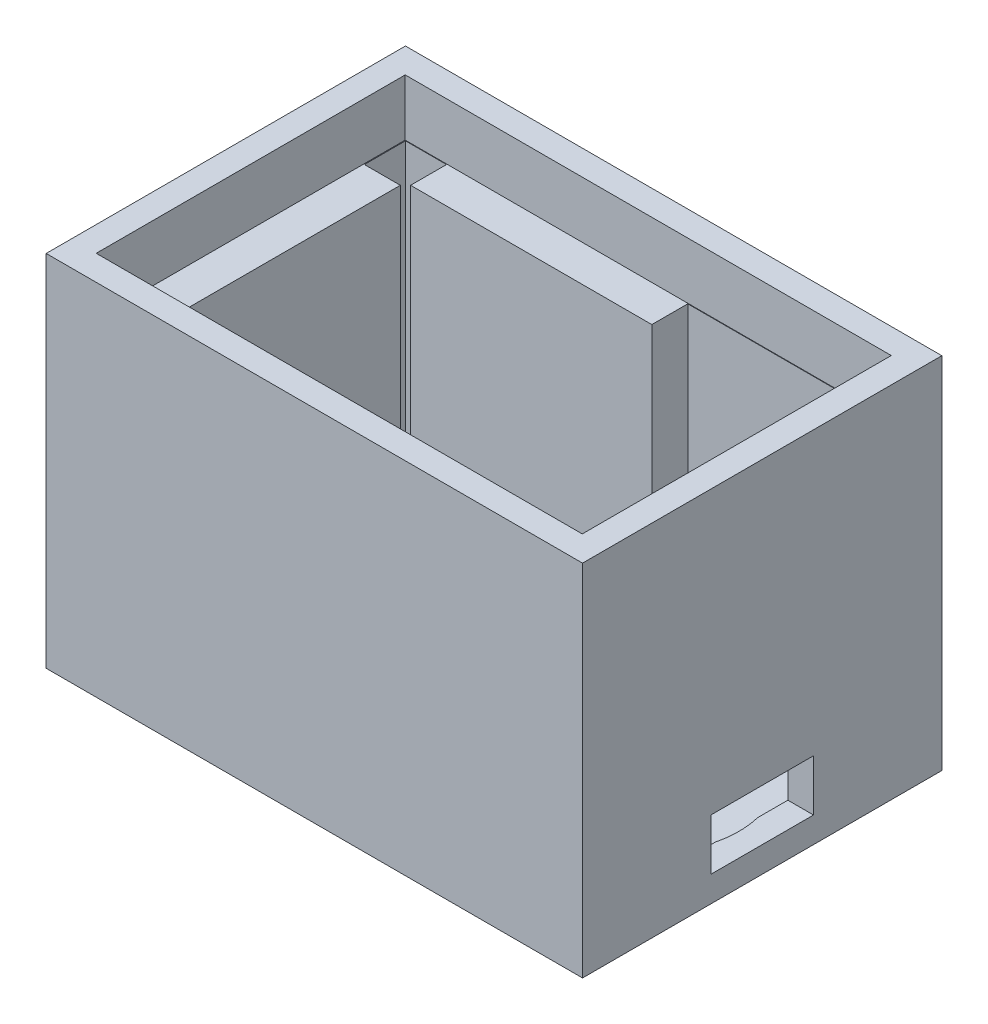
ISO-10303-21;
HEADER;
FILE_DESCRIPTION(('STEP AP214'),'2;1');
FILE_NAME('part.step','',(''),(''),'','','');
FILE_SCHEMA(('AUTOMOTIVE_DESIGN { 1 0 10303 214 1 1 1 1 }'));
ENDSEC;
DATA;
#1=APPLICATION_CONTEXT('core data for automotive mechanical design processes');
#2=APPLICATION_PROTOCOL_DEFINITION('international standard','automotive_design',2000,#1);
#3=PRODUCT_CONTEXT('',#1,'mechanical');
#4=PRODUCT('Part','Part','',(#3));
#5=PRODUCT_RELATED_PRODUCT_CATEGORY('part','',(#4));
#6=PRODUCT_DEFINITION_FORMATION('','',#4);
#7=PRODUCT_DEFINITION_CONTEXT('part definition',#1,'design');
#8=PRODUCT_DEFINITION('design','',#6,#7);
#9=PRODUCT_DEFINITION_SHAPE('','',#8);
#10=(LENGTH_UNIT() NAMED_UNIT(*) SI_UNIT(.MILLI.,.METRE.));
#11=(NAMED_UNIT(*) PLANE_ANGLE_UNIT() SI_UNIT($,.RADIAN.));
#12=(NAMED_UNIT(*) SI_UNIT($,.STERADIAN.) SOLID_ANGLE_UNIT());
#13=UNCERTAINTY_MEASURE_WITH_UNIT(LENGTH_MEASURE(1.E-05),#10,'distance_accuracy_value','');
#14=(GEOMETRIC_REPRESENTATION_CONTEXT(3) GLOBAL_UNCERTAINTY_ASSIGNED_CONTEXT((#13)) GLOBAL_UNIT_ASSIGNED_CONTEXT((#10,
#11,#12)) REPRESENTATION_CONTEXT('',''));
#15=CARTESIAN_POINT('',(0.,0.,0.));
#16=DIRECTION('',(0.,0.,1.));
#17=DIRECTION('',(1.,0.,0.));
#18=AXIS2_PLACEMENT_3D('',#15,#16,#17);
#19=CARTESIAN_POINT('',(82.5,4.00000000000001,-35.));
#20=DIRECTION('',(0.,1.,0.));
#21=DIRECTION('',(0.,0.,1.));
#22=AXIS2_PLACEMENT_3D('',#19,#20,#21);
#23=CYLINDRICAL_SURFACE('',#22,17.5);
#24=DIRECTION('',(0.,1.,0.));
#25=VECTOR('',#24,1.);
#26=CARTESIAN_POINT('',(99.5,4.00000000000001,-39.153311931459));
#27=LINE('',#26,#25);
#28=CARTESIAN_POINT('',(99.5,15.,-39.153311931459));
#29=VERTEX_POINT('',#28);
#30=CARTESIAN_POINT('',(99.5,59.,-39.153311931459));
#31=VERTEX_POINT('',#30);
#32=EDGE_CURVE('E364',#29,#31,#27,.T.);
#33=ORIENTED_EDGE('',*,*,#32,.F.);
#34=CARTESIAN_POINT('',(82.5,15.,-35.));
#35=DIRECTION('',(0.,1.,0.));
#36=DIRECTION('',(0.,0.,1.));
#37=AXIS2_PLACEMENT_3D('',#34,#35,#36);
#38=CIRCLE('',#37,17.5);
#39=CARTESIAN_POINT('',(99.5,15.,-30.846688068541));
#40=VERTEX_POINT('',#39);
#41=EDGE_CURVE('E296',#29,#40,#38,.F.);
#42=ORIENTED_EDGE('',*,*,#41,.T.);
#43=DIRECTION('',(0.,1.,0.));
#44=VECTOR('',#43,1.);
#45=CARTESIAN_POINT('',(99.5,4.00000000000001,-30.846688068541));
#46=LINE('',#45,#44);
#47=CARTESIAN_POINT('',(99.5,59.,-30.846688068541));
#48=VERTEX_POINT('',#47);
#49=EDGE_CURVE('E428',#40,#48,#46,.T.);
#50=ORIENTED_EDGE('',*,*,#49,.T.);
#51=CARTESIAN_POINT('',(82.5,59.,-35.));
#52=DIRECTION('',(0.,1.,0.));
#53=DIRECTION('',(0.,0.,1.));
#54=AXIS2_PLACEMENT_3D('',#51,#52,#53);
#55=CIRCLE('',#54,17.5);
#56=CARTESIAN_POINT('',(99.55,59.,-31.0569681715714));
#57=VERTEX_POINT('',#56);
#58=EDGE_CURVE('E365',#48,#57,#55,.T.);
#59=ORIENTED_EDGE('',*,*,#58,.T.);
#60=CARTESIAN_POINT('',(99.55,59.,-38.9430318284286));
#61=VERTEX_POINT('',#60);
#62=EDGE_CURVE('E302',#57,#61,#55,.T.);
#63=ORIENTED_EDGE('',*,*,#62,.T.);
#64=EDGE_CURVE('E369',#61,#31,#55,.T.);
#65=ORIENTED_EDGE('',*,*,#64,.T.);
#66=EDGE_LOOP('',(#33,#42,#50,#59,#63,#65));
#67=FACE_BOUND('',#66,.T.);
#68=ADVANCED_FACE('F35',(#67),#23,.F.);
#69=CARTESIAN_POINT('',(0.,70.,0.));
#70=DIRECTION('',(1.,0.,0.));
#71=DIRECTION('',(0.,0.,-1.));
#72=AXIS2_PLACEMENT_3D('',#69,#70,#71);
#73=PLANE('',#72);
#74=DIRECTION('',(0.,0.,1.));
#75=VECTOR('',#74,1.);
#76=CARTESIAN_POINT('',(0.,0.,0.));
#77=LINE('',#76,#75);
#78=CARTESIAN_POINT('',(0.,0.,-70.));
#79=VERTEX_POINT('',#78);
#80=CARTESIAN_POINT('',(0.,0.,0.));
#81=VERTEX_POINT('',#80);
#82=EDGE_CURVE('E496',#79,#81,#77,.T.);
#83=ORIENTED_EDGE('',*,*,#82,.T.);
#84=DIRECTION('',(0.,-1.,0.));
#85=VECTOR('',#84,1.);
#86=CARTESIAN_POINT('',(0.,70.,0.));
#87=LINE('',#86,#85);
#88=CARTESIAN_POINT('',(0.,70.,0.));
#89=VERTEX_POINT('',#88);
#90=EDGE_CURVE('E529',#89,#81,#87,.T.);
#91=ORIENTED_EDGE('',*,*,#90,.F.);
#92=DIRECTION('',(0.,0.,1.));
#93=VECTOR('',#92,1.);
#94=CARTESIAN_POINT('',(0.,70.,0.));
#95=LINE('',#94,#93);
#96=CARTESIAN_POINT('',(0.,70.,-70.));
#97=VERTEX_POINT('',#96);
#98=EDGE_CURVE('E503',#97,#89,#95,.T.);
#99=ORIENTED_EDGE('',*,*,#98,.F.);
#100=DIRECTION('',(0.,-1.,0.));
#101=VECTOR('',#100,1.);
#102=CARTESIAN_POINT('',(0.,70.,-70.));
#103=LINE('',#102,#101);
#104=EDGE_CURVE('E513',#97,#79,#103,.T.);
#105=ORIENTED_EDGE('',*,*,#104,.T.);
#106=EDGE_LOOP('',(#83,#91,#99,#105));
#107=FACE_BOUND('',#106,.T.);
#108=ADVANCED_FACE('F37',(#107),#73,.F.);
#109=CARTESIAN_POINT('',(0.,70.,0.));
#110=DIRECTION('',(0.,0.,-1.));
#111=DIRECTION('',(-1.,0.,0.));
#112=AXIS2_PLACEMENT_3D('',#109,#110,#111);
#113=PLANE('',#112);
#114=DIRECTION('',(1.,0.,0.));
#115=VECTOR('',#114,1.);
#116=CARTESIAN_POINT('',(0.,0.,0.));
#117=LINE('',#116,#115);
#118=CARTESIAN_POINT('',(104.5,0.,0.));
#119=VERTEX_POINT('',#118);
#120=EDGE_CURVE('E516',#81,#119,#117,.T.);
#121=ORIENTED_EDGE('',*,*,#120,.T.);
#122=DIRECTION('',(0.,-1.,0.));
#123=VECTOR('',#122,1.);
#124=CARTESIAN_POINT('',(104.5,70.,0.));
#125=LINE('',#124,#123);
#126=CARTESIAN_POINT('',(104.5,70.,0.));
#127=VERTEX_POINT('',#126);
#128=EDGE_CURVE('E526',#127,#119,#125,.T.);
#129=ORIENTED_EDGE('',*,*,#128,.F.);
#130=DIRECTION('',(1.,0.,0.));
#131=VECTOR('',#130,1.);
#132=CARTESIAN_POINT('',(0.,70.,0.));
#133=LINE('',#132,#131);
#134=EDGE_CURVE('E506',#89,#127,#133,.T.);
#135=ORIENTED_EDGE('',*,*,#134,.F.);
#136=ORIENTED_EDGE('',*,*,#90,.T.);
#137=EDGE_LOOP('',(#121,#129,#135,#136));
#138=FACE_BOUND('',#137,.T.);
#139=ADVANCED_FACE('F581',(#138),#113,.F.);
#140=CARTESIAN_POINT('',(104.5,70.,0.));
#141=DIRECTION('',(-1.,0.,0.));
#142=DIRECTION('',(0.,0.,1.));
#143=AXIS2_PLACEMENT_3D('',#140,#141,#142);
#144=PLANE('',#143);
#145=DIRECTION('',(0.,0.,-1.));
#146=VECTOR('',#145,1.);
#147=CARTESIAN_POINT('',(104.5,5.,-25.));
#148=LINE('',#147,#146);
#149=CARTESIAN_POINT('',(104.5,5.,-25.));
#150=VERTEX_POINT('',#149);
#151=CARTESIAN_POINT('',(104.5,5.,-45.));
#152=VERTEX_POINT('',#151);
#153=EDGE_CURVE('E274',#150,#152,#148,.T.);
#154=ORIENTED_EDGE('',*,*,#153,.F.);
#155=DIRECTION('',(0.,-1.,0.));
#156=VECTOR('',#155,1.);
#157=CARTESIAN_POINT('',(104.5,15.,-25.));
#158=LINE('',#157,#156);
#159=CARTESIAN_POINT('',(104.5,15.,-25.));
#160=VERTEX_POINT('',#159);
#161=EDGE_CURVE('E50',#160,#150,#158,.T.);
#162=ORIENTED_EDGE('',*,*,#161,.F.);
#163=DIRECTION('',(0.,0.,1.));
#164=VECTOR('',#163,1.);
#165=CARTESIAN_POINT('',(104.5,15.,-25.));
#166=LINE('',#165,#164);
#167=CARTESIAN_POINT('',(104.5,15.,-45.));
#168=VERTEX_POINT('',#167);
#169=EDGE_CURVE('E281',#168,#160,#166,.T.);
#170=ORIENTED_EDGE('',*,*,#169,.F.);
#171=DIRECTION('',(0.,1.,0.));
#172=VECTOR('',#171,1.);
#173=CARTESIAN_POINT('',(104.5,15.,-45.));
#174=LINE('',#173,#172);
#175=EDGE_CURVE('E265',#152,#168,#174,.T.);
#176=ORIENTED_EDGE('',*,*,#175,.F.);
#177=EDGE_LOOP('',(#154,#162,#170,#176));
#178=FACE_BOUND('',#177,.T.);
#179=DIRECTION('',(0.,0.,-1.));
#180=VECTOR('',#179,1.);
#181=CARTESIAN_POINT('',(104.5,0.,0.));
#182=LINE('',#181,#180);
#183=CARTESIAN_POINT('',(104.5,0.,-70.));
#184=VERTEX_POINT('',#183);
#185=EDGE_CURVE('E518',#119,#184,#182,.T.);
#186=ORIENTED_EDGE('',*,*,#185,.T.);
#187=DIRECTION('',(0.,-1.,0.));
#188=VECTOR('',#187,1.);
#189=CARTESIAN_POINT('',(104.5,70.,-70.));
#190=LINE('',#189,#188);
#191=CARTESIAN_POINT('',(104.5,70.,-70.));
#192=VERTEX_POINT('',#191);
#193=EDGE_CURVE('E523',#192,#184,#190,.T.);
#194=ORIENTED_EDGE('',*,*,#193,.F.);
#195=DIRECTION('',(0.,0.,-1.));
#196=VECTOR('',#195,1.);
#197=CARTESIAN_POINT('',(104.5,70.,0.));
#198=LINE('',#197,#196);
#199=EDGE_CURVE('E509',#127,#192,#198,.T.);
#200=ORIENTED_EDGE('',*,*,#199,.F.);
#201=ORIENTED_EDGE('',*,*,#128,.T.);
#202=EDGE_LOOP('',(#186,#194,#200,#201));
#203=FACE_BOUND('',#202,.T.);
#204=ADVANCED_FACE('F278',(#178,#203),#144,.F.);
#205=CARTESIAN_POINT('',(0.,70.,-70.));
#206=DIRECTION('',(0.,0.,1.));
#207=DIRECTION('',(1.,0.,0.));
#208=AXIS2_PLACEMENT_3D('',#205,#206,#207);
#209=PLANE('',#208);
#210=DIRECTION('',(-1.,0.,0.));
#211=VECTOR('',#210,1.);
#212=CARTESIAN_POINT('',(0.,0.,-70.));
#213=LINE('',#212,#211);
#214=EDGE_CURVE('E507',#184,#79,#213,.T.);
#215=ORIENTED_EDGE('',*,*,#214,.T.);
#216=ORIENTED_EDGE('',*,*,#104,.F.);
#217=DIRECTION('',(-1.,0.,0.));
#218=VECTOR('',#217,1.);
#219=CARTESIAN_POINT('',(0.,70.,-70.));
#220=LINE('',#219,#218);
#221=EDGE_CURVE('E511',#192,#97,#220,.T.);
#222=ORIENTED_EDGE('',*,*,#221,.F.);
#223=ORIENTED_EDGE('',*,*,#193,.T.);
#224=EDGE_LOOP('',(#215,#216,#222,#223));
#225=FACE_BOUND('',#224,.T.);
#226=ADVANCED_FACE('F615',(#225),#209,.F.);
#227=CARTESIAN_POINT('',(0.,70.,0.));
#228=DIRECTION('',(0.,-1.,0.));
#229=DIRECTION('',(0.,0.,-1.));
#230=AXIS2_PLACEMENT_3D('',#227,#228,#229);
#231=PLANE('',#230);
#232=DIRECTION('',(1.,0.,0.));
#233=VECTOR('',#232,1.);
#234=CARTESIAN_POINT('',(4.84999999999999,70.,-4.90000000000002));
#235=LINE('',#234,#233);
#236=CARTESIAN_POINT('',(4.84999999999999,70.,-4.90000000000002));
#237=VERTEX_POINT('',#236);
#238=CARTESIAN_POINT('',(99.55,70.,-4.90000000000002));
#239=VERTEX_POINT('',#238);
#240=EDGE_CURVE('E486',#237,#239,#235,.T.);
#241=ORIENTED_EDGE('',*,*,#240,.F.);
#242=DIRECTION('',(0.,0.,1.));
#243=VECTOR('',#242,1.);
#244=CARTESIAN_POINT('',(4.84999999999999,70.,-65.1));
#245=LINE('',#244,#243);
#246=CARTESIAN_POINT('',(4.84999999999999,70.,-65.1));
#247=VERTEX_POINT('',#246);
#248=EDGE_CURVE('E427',#247,#237,#245,.T.);
#249=ORIENTED_EDGE('',*,*,#248,.F.);
#250=DIRECTION('',(-1.,0.,0.));
#251=VECTOR('',#250,1.);
#252=CARTESIAN_POINT('',(4.84999999999999,70.,-65.1));
#253=LINE('',#252,#251);
#254=CARTESIAN_POINT('',(99.55,70.,-65.1));
#255=VERTEX_POINT('',#254);
#256=EDGE_CURVE('E473',#255,#247,#253,.T.);
#257=ORIENTED_EDGE('',*,*,#256,.F.);
#258=DIRECTION('',(0.,0.,-1.));
#259=VECTOR('',#258,1.);
#260=CARTESIAN_POINT('',(99.55,70.,-65.1));
#261=LINE('',#260,#259);
#262=EDGE_CURVE('E489',#239,#255,#261,.T.);
#263=ORIENTED_EDGE('',*,*,#262,.F.);
#264=EDGE_LOOP('',(#241,#249,#257,#263));
#265=FACE_BOUND('',#264,.T.);
#266=ORIENTED_EDGE('',*,*,#98,.T.);
#267=ORIENTED_EDGE('',*,*,#134,.T.);
#268=ORIENTED_EDGE('',*,*,#199,.T.);
#269=ORIENTED_EDGE('',*,*,#221,.T.);
#270=EDGE_LOOP('',(#266,#267,#268,#269));
#271=FACE_BOUND('',#270,.T.);
#272=ADVANCED_FACE('F612',(#265,#271),#231,.F.);
#273=CARTESIAN_POINT('',(0.,0.,0.));
#274=DIRECTION('',(0.,-1.,0.));
#275=DIRECTION('',(0.,0.,-1.));
#276=AXIS2_PLACEMENT_3D('',#273,#274,#275);
#277=PLANE('',#276);
#278=ORIENTED_EDGE('',*,*,#82,.F.);
#279=ORIENTED_EDGE('',*,*,#214,.F.);
#280=ORIENTED_EDGE('',*,*,#185,.F.);
#281=ORIENTED_EDGE('',*,*,#120,.F.);
#282=EDGE_LOOP('',(#278,#279,#280,#281));
#283=FACE_BOUND('',#282,.T.);
#284=ADVANCED_FACE('F610',(#283),#277,.T.);
#285=CARTESIAN_POINT('',(4.84999999999999,59.,-65.1));
#286=DIRECTION('',(-1.,0.,0.));
#287=DIRECTION('',(0.,0.,1.));
#288=AXIS2_PLACEMENT_3D('',#285,#286,#287);
#289=PLANE('',#288);
#290=ORIENTED_EDGE('',*,*,#248,.T.);
#291=DIRECTION('',(0.,1.,0.));
#292=VECTOR('',#291,1.);
#293=CARTESIAN_POINT('',(4.84999999999999,59.,-4.90000000000002));
#294=LINE('',#293,#292);
#295=CARTESIAN_POINT('',(4.84999999999999,59.,-4.90000000000002));
#296=VERTEX_POINT('',#295);
#297=EDGE_CURVE('E484',#296,#237,#294,.T.);
#298=ORIENTED_EDGE('',*,*,#297,.F.);
#299=DIRECTION('',(0.,0.,1.));
#300=VECTOR('',#299,1.);
#301=CARTESIAN_POINT('',(4.84999999999999,59.,-65.1));
#302=LINE('',#301,#300);
#303=CARTESIAN_POINT('',(4.84999999999999,59.,-65.1));
#304=VERTEX_POINT('',#303);
#305=EDGE_CURVE('E469',#304,#296,#302,.T.);
#306=ORIENTED_EDGE('',*,*,#305,.F.);
#307=DIRECTION('',(0.,1.,0.));
#308=VECTOR('',#307,1.);
#309=CARTESIAN_POINT('',(4.84999999999999,59.,-65.1));
#310=LINE('',#309,#308);
#311=EDGE_CURVE('E494',#304,#247,#310,.T.);
#312=ORIENTED_EDGE('',*,*,#311,.T.);
#313=EDGE_LOOP('',(#290,#298,#306,#312));
#314=FACE_BOUND('',#313,.T.);
#315=ADVANCED_FACE('F603',(#314),#289,.F.);
#316=CARTESIAN_POINT('',(4.84999999999999,59.,-65.1));
#317=DIRECTION('',(0.,0.,-1.));
#318=DIRECTION('',(-1.,0.,0.));
#319=AXIS2_PLACEMENT_3D('',#316,#317,#318);
#320=PLANE('',#319);
#321=ORIENTED_EDGE('',*,*,#256,.T.);
#322=ORIENTED_EDGE('',*,*,#311,.F.);
#323=DIRECTION('',(-1.,0.,0.));
#324=VECTOR('',#323,1.);
#325=CARTESIAN_POINT('',(4.84999999999999,59.,-65.1));
#326=LINE('',#325,#324);
#327=CARTESIAN_POINT('',(99.55,59.,-65.1));
#328=VERTEX_POINT('',#327);
#329=EDGE_CURVE('E480',#328,#304,#326,.T.);
#330=ORIENTED_EDGE('',*,*,#329,.F.);
#331=DIRECTION('',(0.,1.,0.));
#332=VECTOR('',#331,1.);
#333=CARTESIAN_POINT('',(99.55,59.,-65.1));
#334=LINE('',#333,#332);
#335=EDGE_CURVE('E497',#328,#255,#334,.T.);
#336=ORIENTED_EDGE('',*,*,#335,.T.);
#337=EDGE_LOOP('',(#321,#322,#330,#336));
#338=FACE_BOUND('',#337,.T.);
#339=ADVANCED_FACE('F600',(#338),#320,.F.);
#340=CARTESIAN_POINT('',(99.55,59.,-65.1));
#341=DIRECTION('',(1.,0.,0.));
#342=DIRECTION('',(0.,0.,-1.));
#343=AXIS2_PLACEMENT_3D('',#340,#341,#342);
#344=PLANE('',#343);
#345=ORIENTED_EDGE('',*,*,#262,.T.);
#346=ORIENTED_EDGE('',*,*,#335,.F.);
#347=DIRECTION('',(0.,0.,-1.));
#348=VECTOR('',#347,1.);
#349=CARTESIAN_POINT('',(99.55,59.,-65.1));
#350=LINE('',#349,#348);
#351=EDGE_CURVE('E476',#61,#328,#350,.T.);
#352=ORIENTED_EDGE('',*,*,#351,.F.);
#353=EDGE_CURVE('E481',#57,#61,#350,.T.);
#354=ORIENTED_EDGE('',*,*,#353,.F.);
#355=CARTESIAN_POINT('',(99.55,59.,-4.90000000000002));
#356=VERTEX_POINT('',#355);
#357=EDGE_CURVE('E477',#356,#57,#350,.T.);
#358=ORIENTED_EDGE('',*,*,#357,.F.);
#359=DIRECTION('',(0.,1.,0.));
#360=VECTOR('',#359,1.);
#361=CARTESIAN_POINT('',(99.55,59.,-4.90000000000002));
#362=LINE('',#361,#360);
#363=EDGE_CURVE('E499',#356,#239,#362,.T.);
#364=ORIENTED_EDGE('',*,*,#363,.T.);
#365=EDGE_LOOP('',(#345,#346,#352,#354,#358,#364));
#366=FACE_BOUND('',#365,.T.);
#367=ADVANCED_FACE('F596',(#366),#344,.F.);
#368=CARTESIAN_POINT('',(4.84999999999999,59.,-4.90000000000002));
#369=DIRECTION('',(0.,0.,1.));
#370=DIRECTION('',(1.,0.,0.));
#371=AXIS2_PLACEMENT_3D('',#368,#369,#370);
#372=PLANE('',#371);
#373=ORIENTED_EDGE('',*,*,#240,.T.);
#374=ORIENTED_EDGE('',*,*,#363,.F.);
#375=DIRECTION('',(1.,0.,0.));
#376=VECTOR('',#375,1.);
#377=CARTESIAN_POINT('',(4.84999999999999,59.,-4.90000000000002));
#378=LINE('',#377,#376);
#379=EDGE_CURVE('E472',#296,#356,#378,.T.);
#380=ORIENTED_EDGE('',*,*,#379,.F.);
#381=ORIENTED_EDGE('',*,*,#297,.T.);
#382=EDGE_LOOP('',(#373,#374,#380,#381));
#383=FACE_BOUND('',#382,.T.);
#384=ADVANCED_FACE('F592',(#383),#372,.F.);
#385=CARTESIAN_POINT('',(0.,59.,0.));
#386=DIRECTION('',(0.,1.,0.));
#387=DIRECTION('',(0.,0.,1.));
#388=AXIS2_PLACEMENT_3D('',#385,#386,#387);
#389=PLANE('',#388);
#390=ORIENTED_EDGE('',*,*,#58,.F.);
#391=DIRECTION('',(0.,0.,-1.));
#392=VECTOR('',#391,1.);
#393=CARTESIAN_POINT('',(99.5,59.,-12.));
#394=LINE('',#393,#392);
#395=CARTESIAN_POINT('',(99.5,59.,-12.));
#396=VERTEX_POINT('',#395);
#397=EDGE_CURVE('E307',#396,#48,#394,.T.);
#398=ORIENTED_EDGE('',*,*,#397,.F.);
#399=DIRECTION('',(1.,0.,0.));
#400=VECTOR('',#399,1.);
#401=CARTESIAN_POINT('',(88.1940758688307,59.,-12.));
#402=LINE('',#401,#400);
#403=CARTESIAN_POINT('',(88.1940758688307,59.,-12.));
#404=VERTEX_POINT('',#403);
#405=EDGE_CURVE('E420',#404,#396,#402,.T.);
#406=ORIENTED_EDGE('',*,*,#405,.F.);
#407=CARTESIAN_POINT('',(82.5,59.,-11.2));
#408=DIRECTION('',(0.,1.,0.));
#409=DIRECTION('',(0.,0.,-1.));
#410=AXIS2_PLACEMENT_3D('',#407,#408,#409);
#411=CIRCLE('',#410,5.75);
#412=CARTESIAN_POINT('',(76.8059241311693,59.,-12.));
#413=VERTEX_POINT('',#412);
#414=EDGE_CURVE('E417',#413,#404,#411,.T.);
#415=ORIENTED_EDGE('',*,*,#414,.F.);
#416=DIRECTION('',(1.,0.,0.));
#417=VECTOR('',#416,1.);
#418=CARTESIAN_POINT('',(71.9073450074802,59.,-12.));
#419=LINE('',#418,#417);
#420=CARTESIAN_POINT('',(71.9073450074802,59.,-12.));
#421=VERTEX_POINT('',#420);
#422=EDGE_CURVE('E414',#421,#413,#419,.T.);
#423=ORIENTED_EDGE('',*,*,#422,.F.);
#424=CARTESIAN_POINT('',(68.5,59.,-11.2));
#425=DIRECTION('',(0.,1.,0.));
#426=DIRECTION('',(0.,0.,-1.));
#427=AXIS2_PLACEMENT_3D('',#424,#425,#426);
#428=CIRCLE('',#427,3.5);
#429=CARTESIAN_POINT('',(65.0926549925198,59.,-12.));
#430=VERTEX_POINT('',#429);
#431=EDGE_CURVE('E411',#430,#421,#428,.T.);
#432=ORIENTED_EDGE('',*,*,#431,.F.);
#433=DIRECTION('',(1.,0.,0.));
#434=VECTOR('',#433,1.);
#435=CARTESIAN_POINT('',(36.0475478405714,59.,-12.));
#436=LINE('',#435,#434);
#437=CARTESIAN_POINT('',(36.0475478405714,59.,-12.));
#438=VERTEX_POINT('',#437);
#439=EDGE_CURVE('E408',#438,#430,#436,.T.);
#440=ORIENTED_EDGE('',*,*,#439,.F.);
#441=CARTESIAN_POINT('',(33.5,59.,-9.60000000000001));
#442=DIRECTION('',(0.,1.,0.));
#443=DIRECTION('',(0.,0.,-1.));
#444=AXIS2_PLACEMENT_3D('',#441,#442,#443);
#445=CIRCLE('',#444,3.5);
#446=CARTESIAN_POINT('',(30.9524521594286,59.,-12.));
#447=VERTEX_POINT('',#446);
#448=EDGE_CURVE('E405',#447,#438,#445,.T.);
#449=ORIENTED_EDGE('',*,*,#448,.F.);
#450=DIRECTION('',(1.,0.,0.));
#451=VECTOR('',#450,1.);
#452=CARTESIAN_POINT('',(12.,59.,-12.));
#453=LINE('',#452,#451);
#454=CARTESIAN_POINT('',(12.,59.,-12.));
#455=VERTEX_POINT('',#454);
#456=EDGE_CURVE('E402',#455,#447,#453,.T.);
#457=ORIENTED_EDGE('',*,*,#456,.F.);
#458=DIRECTION('',(0.,0.,1.));
#459=VECTOR('',#458,1.);
#460=CARTESIAN_POINT('',(12.,59.,-12.));
#461=LINE('',#460,#459);
#462=CARTESIAN_POINT('',(12.,59.,-57.));
#463=VERTEX_POINT('',#462);
#464=EDGE_CURVE('E399',#463,#455,#461,.T.);
#465=ORIENTED_EDGE('',*,*,#464,.F.);
#466=DIRECTION('',(1.,0.,0.));
#467=VECTOR('',#466,1.);
#468=CARTESIAN_POINT('',(4.99999999999998,59.,-57.));
#469=LINE('',#468,#467);
#470=CARTESIAN_POINT('',(4.99999999999998,59.,-57.));
#471=VERTEX_POINT('',#470);
#472=EDGE_CURVE('E396',#471,#463,#469,.T.);
#473=ORIENTED_EDGE('',*,*,#472,.F.);
#474=DIRECTION('',(0.,0.,1.));
#475=VECTOR('',#474,1.);
#476=CARTESIAN_POINT('',(4.99999999999999,59.,-65.));
#477=LINE('',#476,#475);
#478=CARTESIAN_POINT('',(4.99999999999999,59.,-65.));
#479=VERTEX_POINT('',#478);
#480=EDGE_CURVE('E393',#479,#471,#477,.T.);
#481=ORIENTED_EDGE('',*,*,#480,.F.);
#482=DIRECTION('',(-1.,0.,0.));
#483=VECTOR('',#482,1.);
#484=CARTESIAN_POINT('',(4.99999999999999,59.,-65.));
#485=LINE('',#484,#483);
#486=CARTESIAN_POINT('',(13.,59.,-65.));
#487=VERTEX_POINT('',#486);
#488=EDGE_CURVE('E390',#487,#479,#485,.T.);
#489=ORIENTED_EDGE('',*,*,#488,.F.);
#490=DIRECTION('',(0.,0.,-1.));
#491=VECTOR('',#490,1.);
#492=CARTESIAN_POINT('',(13.,59.,-65.));
#493=LINE('',#492,#491);
#494=CARTESIAN_POINT('',(13.,59.,-58.));
#495=VERTEX_POINT('',#494);
#496=EDGE_CURVE('E387',#495,#487,#493,.T.);
#497=ORIENTED_EDGE('',*,*,#496,.F.);
#498=DIRECTION('',(-1.,0.,0.));
#499=VECTOR('',#498,1.);
#500=CARTESIAN_POINT('',(13.,59.,-58.));
#501=LINE('',#500,#499);
#502=CARTESIAN_POINT('',(60.,59.,-58.));
#503=VERTEX_POINT('',#502);
#504=EDGE_CURVE('E384',#503,#495,#501,.T.);
#505=ORIENTED_EDGE('',*,*,#504,.F.);
#506=DIRECTION('',(0.,0.,1.));
#507=VECTOR('',#506,1.);
#508=CARTESIAN_POINT('',(60.,59.,-58.));
#509=LINE('',#508,#507);
#510=CARTESIAN_POINT('',(60.,59.,-65.));
#511=VERTEX_POINT('',#510);
#512=EDGE_CURVE('E381',#511,#503,#509,.T.);
#513=ORIENTED_EDGE('',*,*,#512,.F.);
#514=DIRECTION('',(-1.,0.,0.));
#515=VECTOR('',#514,1.);
#516=CARTESIAN_POINT('',(60.,59.,-65.));
#517=LINE('',#516,#515);
#518=CARTESIAN_POINT('',(90.5,59.,-65.));
#519=VERTEX_POINT('',#518);
#520=EDGE_CURVE('E378',#519,#511,#517,.T.);
#521=ORIENTED_EDGE('',*,*,#520,.F.);
#522=DIRECTION('',(0.,0.,-1.));
#523=VECTOR('',#522,1.);
#524=CARTESIAN_POINT('',(90.5,59.,-58.));
#525=LINE('',#524,#523);
#526=CARTESIAN_POINT('',(90.5,59.,-58.));
#527=VERTEX_POINT('',#526);
#528=EDGE_CURVE('E375',#527,#519,#525,.T.);
#529=ORIENTED_EDGE('',*,*,#528,.F.);
#530=DIRECTION('',(-1.,0.,0.));
#531=VECTOR('',#530,1.);
#532=CARTESIAN_POINT('',(90.5,59.,-58.));
#533=LINE('',#532,#531);
#534=CARTESIAN_POINT('',(99.5,59.,-58.));
#535=VERTEX_POINT('',#534);
#536=EDGE_CURVE('E372',#535,#527,#533,.T.);
#537=ORIENTED_EDGE('',*,*,#536,.F.);
#538=DIRECTION('',(0.,0.,-1.));
#539=VECTOR('',#538,1.);
#540=CARTESIAN_POINT('',(99.5,59.,-39.153311931459));
#541=LINE('',#540,#539);
#542=EDGE_CURVE('E368',#31,#535,#541,.T.);
#543=ORIENTED_EDGE('',*,*,#542,.F.);
#544=ORIENTED_EDGE('',*,*,#64,.F.);
#545=ORIENTED_EDGE('',*,*,#351,.T.);
#546=ORIENTED_EDGE('',*,*,#329,.T.);
#547=ORIENTED_EDGE('',*,*,#305,.T.);
#548=ORIENTED_EDGE('',*,*,#379,.T.);
#549=ORIENTED_EDGE('',*,*,#357,.T.);
#550=EDGE_LOOP('',(#390,#398,#406,#415,#423,#432,#440,#449,#457,#465,#473,#481,#489,#497,#505,
#513,#521,#529,#537,#543,#544,#545,#546,#547,#548,#549));
#551=FACE_BOUND('',#550,.T.);
#552=ADVANCED_FACE('F549',(#551),#389,.T.);
#553=CARTESIAN_POINT('',(99.5,4.00000000000001,-30.846688068541));
#554=VERTEX_POINT('',#553);
#555=CARTESIAN_POINT('',(99.5,5.,-30.846688068541));
#556=VERTEX_POINT('',#555);
#557=EDGE_CURVE('E424',#554,#556,#46,.T.);
#558=ORIENTED_EDGE('',*,*,#557,.T.);
#559=CARTESIAN_POINT('',(82.5,5.,-35.));
#560=DIRECTION('',(0.,-1.,0.));
#561=DIRECTION('',(0.,0.,-1.));
#562=AXIS2_PLACEMENT_3D('',#559,#560,#561);
#563=CIRCLE('',#562,17.5);
#564=CARTESIAN_POINT('',(99.5,5.,-39.153311931459));
#565=VERTEX_POINT('',#564);
#566=EDGE_CURVE('E288',#556,#565,#563,.F.);
#567=ORIENTED_EDGE('',*,*,#566,.T.);
#568=CARTESIAN_POINT('',(99.5,4.00000000000001,-39.153311931459));
#569=VERTEX_POINT('',#568);
#570=EDGE_CURVE('E466',#569,#565,#27,.T.);
#571=ORIENTED_EDGE('',*,*,#570,.F.);
#572=CARTESIAN_POINT('',(82.5,4.00000000000001,-35.));
#573=DIRECTION('',(0.,1.,0.));
#574=DIRECTION('',(0.,0.,1.));
#575=AXIS2_PLACEMENT_3D('',#572,#573,#574);
#576=CIRCLE('',#575,17.5);
#577=EDGE_CURVE('E303',#554,#569,#576,.T.);
#578=ORIENTED_EDGE('',*,*,#577,.F.);
#579=EDGE_LOOP('',(#558,#567,#571,#578));
#580=FACE_BOUND('',#579,.T.);
#581=ADVANCED_FACE('F561',(#580),#23,.F.);
#582=CARTESIAN_POINT('',(99.5,4.00000000000001,-12.));
#583=DIRECTION('',(1.,0.,0.));
#584=DIRECTION('',(0.,0.,-1.));
#585=AXIS2_PLACEMENT_3D('',#582,#583,#584);
#586=PLANE('',#585);
#587=ORIENTED_EDGE('',*,*,#49,.F.);
#588=DIRECTION('',(0.,0.,1.));
#589=VECTOR('',#588,1.);
#590=CARTESIAN_POINT('',(99.5,15.,-12.));
#591=LINE('',#590,#589);
#592=CARTESIAN_POINT('',(99.5,15.,-25.));
#593=VERTEX_POINT('',#592);
#594=EDGE_CURVE('E299',#40,#593,#591,.T.);
#595=ORIENTED_EDGE('',*,*,#594,.T.);
#596=DIRECTION('',(0.,-1.,0.));
#597=VECTOR('',#596,1.);
#598=CARTESIAN_POINT('',(99.5,4.00000000000001,-25.));
#599=LINE('',#598,#597);
#600=CARTESIAN_POINT('',(99.5,5.,-25.));
#601=VERTEX_POINT('',#600);
#602=EDGE_CURVE('E11',#593,#601,#599,.T.);
#603=ORIENTED_EDGE('',*,*,#602,.T.);
#604=DIRECTION('',(0.,0.,-1.));
#605=VECTOR('',#604,1.);
#606=CARTESIAN_POINT('',(99.5,5.,-12.));
#607=LINE('',#606,#605);
#608=EDGE_CURVE('E293',#601,#556,#607,.T.);
#609=ORIENTED_EDGE('',*,*,#608,.T.);
#610=ORIENTED_EDGE('',*,*,#557,.F.);
#611=DIRECTION('',(0.,0.,-1.));
#612=VECTOR('',#611,1.);
#613=CARTESIAN_POINT('',(99.5,4.00000000000001,-12.));
#614=LINE('',#613,#612);
#615=CARTESIAN_POINT('',(99.5,4.00000000000001,-12.));
#616=VERTEX_POINT('',#615);
#617=EDGE_CURVE('E361',#616,#554,#614,.T.);
#618=ORIENTED_EDGE('',*,*,#617,.F.);
#619=DIRECTION('',(0.,1.,0.));
#620=VECTOR('',#619,1.);
#621=CARTESIAN_POINT('',(99.5,4.00000000000001,-12.));
#622=LINE('',#621,#620);
#623=EDGE_CURVE('E429',#616,#396,#622,.T.);
#624=ORIENTED_EDGE('',*,*,#623,.T.);
#625=ORIENTED_EDGE('',*,*,#397,.T.);
#626=EDGE_LOOP('',(#587,#595,#603,#609,#610,#618,#624,#625));
#627=FACE_BOUND('',#626,.T.);
#628=ADVANCED_FACE('F563',(#627),#586,.F.);
#629=CARTESIAN_POINT('',(88.1940758688307,4.00000000000001,-12.));
#630=DIRECTION('',(0.,0.,1.));
#631=DIRECTION('',(1.,0.,0.));
#632=AXIS2_PLACEMENT_3D('',#629,#630,#631);
#633=PLANE('',#632);
#634=ORIENTED_EDGE('',*,*,#405,.T.);
#635=ORIENTED_EDGE('',*,*,#623,.F.);
#636=DIRECTION('',(1.,0.,0.));
#637=VECTOR('',#636,1.);
#638=CARTESIAN_POINT('',(88.1940758688307,4.00000000000001,-12.));
#639=LINE('',#638,#637);
#640=CARTESIAN_POINT('',(88.1940758688307,4.00000000000001,-12.));
#641=VERTEX_POINT('',#640);
#642=EDGE_CURVE('E358',#641,#616,#639,.T.);
#643=ORIENTED_EDGE('',*,*,#642,.F.);
#644=DIRECTION('',(0.,1.,0.));
#645=VECTOR('',#644,1.);
#646=CARTESIAN_POINT('',(88.1940758688307,4.00000000000001,-12.));
#647=LINE('',#646,#645);
#648=EDGE_CURVE('E432',#641,#404,#647,.T.);
#649=ORIENTED_EDGE('',*,*,#648,.T.);
#650=EDGE_LOOP('',(#634,#635,#643,#649));
#651=FACE_BOUND('',#650,.T.);
#652=ADVANCED_FACE('F590',(#651),#633,.F.);
#653=CARTESIAN_POINT('',(82.5,4.00000000000001,-11.2));
#654=DIRECTION('',(0.,1.,0.));
#655=DIRECTION('',(0.,0.,1.));
#656=AXIS2_PLACEMENT_3D('',#653,#654,#655);
#657=CYLINDRICAL_SURFACE('',#656,5.75);
#658=ORIENTED_EDGE('',*,*,#414,.T.);
#659=ORIENTED_EDGE('',*,*,#648,.F.);
#660=CARTESIAN_POINT('',(82.5,4.00000000000001,-11.2));
#661=DIRECTION('',(0.,1.,0.));
#662=DIRECTION('',(0.,0.,-1.));
#663=AXIS2_PLACEMENT_3D('',#660,#661,#662);
#664=CIRCLE('',#663,5.75);
#665=CARTESIAN_POINT('',(76.8059241311693,4.00000000000001,-12.));
#666=VERTEX_POINT('',#665);
#667=EDGE_CURVE('E355',#666,#641,#664,.T.);
#668=ORIENTED_EDGE('',*,*,#667,.F.);
#669=DIRECTION('',(0.,1.,0.));
#670=VECTOR('',#669,1.);
#671=CARTESIAN_POINT('',(76.8059241311693,4.00000000000001,-12.));
#672=LINE('',#671,#670);
#673=EDGE_CURVE('E434',#666,#413,#672,.T.);
#674=ORIENTED_EDGE('',*,*,#673,.T.);
#675=EDGE_LOOP('',(#658,#659,#668,#674));
#676=FACE_BOUND('',#675,.T.);
#677=ADVANCED_FACE('F699',(#676),#657,.F.);
#678=CARTESIAN_POINT('',(71.9073450074802,4.00000000000001,-12.));
#679=DIRECTION('',(0.,0.,1.));
#680=DIRECTION('',(1.,0.,0.));
#681=AXIS2_PLACEMENT_3D('',#678,#679,#680);
#682=PLANE('',#681);
#683=ORIENTED_EDGE('',*,*,#422,.T.);
#684=ORIENTED_EDGE('',*,*,#673,.F.);
#685=DIRECTION('',(1.,0.,0.));
#686=VECTOR('',#685,1.);
#687=CARTESIAN_POINT('',(71.9073450074802,4.00000000000001,-12.));
#688=LINE('',#687,#686);
#689=CARTESIAN_POINT('',(71.9073450074802,4.00000000000001,-12.));
#690=VERTEX_POINT('',#689);
#691=EDGE_CURVE('E352',#690,#666,#688,.T.);
#692=ORIENTED_EDGE('',*,*,#691,.F.);
#693=DIRECTION('',(0.,1.,0.));
#694=VECTOR('',#693,1.);
#695=CARTESIAN_POINT('',(71.9073450074802,4.00000000000001,-12.));
#696=LINE('',#695,#694);
#697=EDGE_CURVE('E436',#690,#421,#696,.T.);
#698=ORIENTED_EDGE('',*,*,#697,.T.);
#699=EDGE_LOOP('',(#683,#684,#692,#698));
#700=FACE_BOUND('',#699,.T.);
#701=ADVANCED_FACE('F708',(#700),#682,.F.);
#702=CARTESIAN_POINT('',(68.5,4.00000000000001,-11.2));
#703=DIRECTION('',(0.,1.,0.));
#704=DIRECTION('',(0.,0.,1.));
#705=AXIS2_PLACEMENT_3D('',#702,#703,#704);
#706=CYLINDRICAL_SURFACE('',#705,3.5);
#707=ORIENTED_EDGE('',*,*,#431,.T.);
#708=ORIENTED_EDGE('',*,*,#697,.F.);
#709=CARTESIAN_POINT('',(68.5,4.00000000000001,-11.2));
#710=DIRECTION('',(0.,1.,0.));
#711=DIRECTION('',(0.,0.,-1.));
#712=AXIS2_PLACEMENT_3D('',#709,#710,#711);
#713=CIRCLE('',#712,3.5);
#714=CARTESIAN_POINT('',(65.0926549925198,4.00000000000001,-12.));
#715=VERTEX_POINT('',#714);
#716=EDGE_CURVE('E349',#715,#690,#713,.T.);
#717=ORIENTED_EDGE('',*,*,#716,.F.);
#718=DIRECTION('',(0.,1.,0.));
#719=VECTOR('',#718,1.);
#720=CARTESIAN_POINT('',(65.0926549925198,4.00000000000001,-12.));
#721=LINE('',#720,#719);
#722=EDGE_CURVE('E438',#715,#430,#721,.T.);
#723=ORIENTED_EDGE('',*,*,#722,.T.);
#724=EDGE_LOOP('',(#707,#708,#717,#723));
#725=FACE_BOUND('',#724,.T.);
#726=ADVANCED_FACE('F717',(#725),#706,.F.);
#727=CARTESIAN_POINT('',(36.0475478405714,4.00000000000001,-12.));
#728=DIRECTION('',(0.,0.,1.));
#729=DIRECTION('',(1.,0.,0.));
#730=AXIS2_PLACEMENT_3D('',#727,#728,#729);
#731=PLANE('',#730);
#732=ORIENTED_EDGE('',*,*,#439,.T.);
#733=ORIENTED_EDGE('',*,*,#722,.F.);
#734=DIRECTION('',(1.,0.,0.));
#735=VECTOR('',#734,1.);
#736=CARTESIAN_POINT('',(36.0475478405714,4.00000000000001,-12.));
#737=LINE('',#736,#735);
#738=CARTESIAN_POINT('',(36.0475478405714,4.00000000000001,-12.));
#739=VERTEX_POINT('',#738);
#740=EDGE_CURVE('E346',#739,#715,#737,.T.);
#741=ORIENTED_EDGE('',*,*,#740,.F.);
#742=DIRECTION('',(0.,1.,0.));
#743=VECTOR('',#742,1.);
#744=CARTESIAN_POINT('',(36.0475478405714,4.00000000000001,-12.));
#745=LINE('',#744,#743);
#746=EDGE_CURVE('E440',#739,#438,#745,.T.);
#747=ORIENTED_EDGE('',*,*,#746,.T.);
#748=EDGE_LOOP('',(#732,#733,#741,#747));
#749=FACE_BOUND('',#748,.T.);
#750=ADVANCED_FACE('F726',(#749),#731,.F.);
#751=CARTESIAN_POINT('',(33.5,4.00000000000001,-9.60000000000001));
#752=DIRECTION('',(0.,1.,0.));
#753=DIRECTION('',(0.,0.,1.));
#754=AXIS2_PLACEMENT_3D('',#751,#752,#753);
#755=CYLINDRICAL_SURFACE('',#754,3.5);
#756=ORIENTED_EDGE('',*,*,#448,.T.);
#757=ORIENTED_EDGE('',*,*,#746,.F.);
#758=CARTESIAN_POINT('',(33.5,4.00000000000001,-9.60000000000001));
#759=DIRECTION('',(0.,1.,0.));
#760=DIRECTION('',(0.,0.,-1.));
#761=AXIS2_PLACEMENT_3D('',#758,#759,#760);
#762=CIRCLE('',#761,3.5);
#763=CARTESIAN_POINT('',(30.9524521594286,4.00000000000001,-12.));
#764=VERTEX_POINT('',#763);
#765=EDGE_CURVE('E343',#764,#739,#762,.T.);
#766=ORIENTED_EDGE('',*,*,#765,.F.);
#767=DIRECTION('',(0.,1.,0.));
#768=VECTOR('',#767,1.);
#769=CARTESIAN_POINT('',(30.9524521594286,4.00000000000001,-12.));
#770=LINE('',#769,#768);
#771=EDGE_CURVE('E442',#764,#447,#770,.T.);
#772=ORIENTED_EDGE('',*,*,#771,.T.);
#773=EDGE_LOOP('',(#756,#757,#766,#772));
#774=FACE_BOUND('',#773,.T.);
#775=ADVANCED_FACE('F735',(#774),#755,.F.);
#776=CARTESIAN_POINT('',(12.,4.00000000000001,-12.));
#777=DIRECTION('',(0.,0.,1.));
#778=DIRECTION('',(1.,0.,0.));
#779=AXIS2_PLACEMENT_3D('',#776,#777,#778);
#780=PLANE('',#779);
#781=ORIENTED_EDGE('',*,*,#456,.T.);
#782=ORIENTED_EDGE('',*,*,#771,.F.);
#783=DIRECTION('',(1.,0.,0.));
#784=VECTOR('',#783,1.);
#785=CARTESIAN_POINT('',(12.,4.00000000000001,-12.));
#786=LINE('',#785,#784);
#787=CARTESIAN_POINT('',(12.,4.00000000000001,-12.));
#788=VERTEX_POINT('',#787);
#789=EDGE_CURVE('E340',#788,#764,#786,.T.);
#790=ORIENTED_EDGE('',*,*,#789,.F.);
#791=DIRECTION('',(0.,1.,0.));
#792=VECTOR('',#791,1.);
#793=CARTESIAN_POINT('',(12.,4.00000000000001,-12.));
#794=LINE('',#793,#792);
#795=EDGE_CURVE('E444',#788,#455,#794,.T.);
#796=ORIENTED_EDGE('',*,*,#795,.T.);
#797=EDGE_LOOP('',(#781,#782,#790,#796));
#798=FACE_BOUND('',#797,.T.);
#799=ADVANCED_FACE('F744',(#798),#780,.F.);
#800=CARTESIAN_POINT('',(12.,4.00000000000001,-12.));
#801=DIRECTION('',(-1.,0.,0.));
#802=DIRECTION('',(0.,0.,1.));
#803=AXIS2_PLACEMENT_3D('',#800,#801,#802);
#804=PLANE('',#803);
#805=ORIENTED_EDGE('',*,*,#464,.T.);
#806=ORIENTED_EDGE('',*,*,#795,.F.);
#807=DIRECTION('',(0.,0.,1.));
#808=VECTOR('',#807,1.);
#809=CARTESIAN_POINT('',(12.,4.00000000000001,-12.));
#810=LINE('',#809,#808);
#811=CARTESIAN_POINT('',(12.,4.00000000000001,-57.));
#812=VERTEX_POINT('',#811);
#813=EDGE_CURVE('E337',#812,#788,#810,.T.);
#814=ORIENTED_EDGE('',*,*,#813,.F.);
#815=DIRECTION('',(0.,1.,0.));
#816=VECTOR('',#815,1.);
#817=CARTESIAN_POINT('',(12.,4.00000000000001,-57.));
#818=LINE('',#817,#816);
#819=EDGE_CURVE('E446',#812,#463,#818,.T.);
#820=ORIENTED_EDGE('',*,*,#819,.T.);
#821=EDGE_LOOP('',(#805,#806,#814,#820));
#822=FACE_BOUND('',#821,.T.);
#823=ADVANCED_FACE('F753',(#822),#804,.F.);
#824=CARTESIAN_POINT('',(4.99999999999998,4.00000000000001,-57.));
#825=DIRECTION('',(0.,0.,1.));
#826=DIRECTION('',(1.,0.,0.));
#827=AXIS2_PLACEMENT_3D('',#824,#825,#826);
#828=PLANE('',#827);
#829=ORIENTED_EDGE('',*,*,#472,.T.);
#830=ORIENTED_EDGE('',*,*,#819,.F.);
#831=DIRECTION('',(1.,0.,0.));
#832=VECTOR('',#831,1.);
#833=CARTESIAN_POINT('',(4.99999999999998,4.00000000000001,-57.));
#834=LINE('',#833,#832);
#835=CARTESIAN_POINT('',(4.99999999999998,4.00000000000001,-57.));
#836=VERTEX_POINT('',#835);
#837=EDGE_CURVE('E334',#836,#812,#834,.T.);
#838=ORIENTED_EDGE('',*,*,#837,.F.);
#839=DIRECTION('',(0.,1.,0.));
#840=VECTOR('',#839,1.);
#841=CARTESIAN_POINT('',(4.99999999999998,4.00000000000001,-57.));
#842=LINE('',#841,#840);
#843=EDGE_CURVE('E448',#836,#471,#842,.T.);
#844=ORIENTED_EDGE('',*,*,#843,.T.);
#845=EDGE_LOOP('',(#829,#830,#838,#844));
#846=FACE_BOUND('',#845,.T.);
#847=ADVANCED_FACE('F762',(#846),#828,.F.);
#848=CARTESIAN_POINT('',(4.99999999999999,4.00000000000001,-65.));
#849=DIRECTION('',(-1.,0.,0.));
#850=DIRECTION('',(0.,0.,1.));
#851=AXIS2_PLACEMENT_3D('',#848,#849,#850);
#852=PLANE('',#851);
#853=ORIENTED_EDGE('',*,*,#480,.T.);
#854=ORIENTED_EDGE('',*,*,#843,.F.);
#855=DIRECTION('',(0.,0.,1.));
#856=VECTOR('',#855,1.);
#857=CARTESIAN_POINT('',(4.99999999999999,4.00000000000001,-65.));
#858=LINE('',#857,#856);
#859=CARTESIAN_POINT('',(4.99999999999999,4.00000000000001,-65.));
#860=VERTEX_POINT('',#859);
#861=EDGE_CURVE('E331',#860,#836,#858,.T.);
#862=ORIENTED_EDGE('',*,*,#861,.F.);
#863=DIRECTION('',(0.,1.,0.));
#864=VECTOR('',#863,1.);
#865=CARTESIAN_POINT('',(4.99999999999999,4.00000000000001,-65.));
#866=LINE('',#865,#864);
#867=EDGE_CURVE('E450',#860,#479,#866,.T.);
#868=ORIENTED_EDGE('',*,*,#867,.T.);
#869=EDGE_LOOP('',(#853,#854,#862,#868));
#870=FACE_BOUND('',#869,.T.);
#871=ADVANCED_FACE('F771',(#870),#852,.F.);
#872=CARTESIAN_POINT('',(4.99999999999999,4.00000000000001,-65.));
#873=DIRECTION('',(0.,0.,-1.));
#874=DIRECTION('',(-1.,0.,0.));
#875=AXIS2_PLACEMENT_3D('',#872,#873,#874);
#876=PLANE('',#875);
#877=ORIENTED_EDGE('',*,*,#488,.T.);
#878=ORIENTED_EDGE('',*,*,#867,.F.);
#879=DIRECTION('',(-1.,0.,0.));
#880=VECTOR('',#879,1.);
#881=CARTESIAN_POINT('',(4.99999999999999,4.00000000000001,-65.));
#882=LINE('',#881,#880);
#883=CARTESIAN_POINT('',(13.,4.00000000000001,-65.));
#884=VERTEX_POINT('',#883);
#885=EDGE_CURVE('E328',#884,#860,#882,.T.);
#886=ORIENTED_EDGE('',*,*,#885,.F.);
#887=DIRECTION('',(0.,1.,0.));
#888=VECTOR('',#887,1.);
#889=CARTESIAN_POINT('',(13.,4.00000000000001,-65.));
#890=LINE('',#889,#888);
#891=EDGE_CURVE('E452',#884,#487,#890,.T.);
#892=ORIENTED_EDGE('',*,*,#891,.T.);
#893=EDGE_LOOP('',(#877,#878,#886,#892));
#894=FACE_BOUND('',#893,.T.);
#895=ADVANCED_FACE('F780',(#894),#876,.F.);
#896=CARTESIAN_POINT('',(13.,4.00000000000001,-65.));
#897=DIRECTION('',(1.,0.,0.));
#898=DIRECTION('',(0.,0.,-1.));
#899=AXIS2_PLACEMENT_3D('',#896,#897,#898);
#900=PLANE('',#899);
#901=ORIENTED_EDGE('',*,*,#496,.T.);
#902=ORIENTED_EDGE('',*,*,#891,.F.);
#903=DIRECTION('',(0.,0.,-1.));
#904=VECTOR('',#903,1.);
#905=CARTESIAN_POINT('',(13.,4.00000000000001,-65.));
#906=LINE('',#905,#904);
#907=CARTESIAN_POINT('',(13.,4.00000000000001,-58.));
#908=VERTEX_POINT('',#907);
#909=EDGE_CURVE('E325',#908,#884,#906,.T.);
#910=ORIENTED_EDGE('',*,*,#909,.F.);
#911=DIRECTION('',(0.,1.,0.));
#912=VECTOR('',#911,1.);
#913=CARTESIAN_POINT('',(13.,4.00000000000001,-58.));
#914=LINE('',#913,#912);
#915=EDGE_CURVE('E454',#908,#495,#914,.T.);
#916=ORIENTED_EDGE('',*,*,#915,.T.);
#917=EDGE_LOOP('',(#901,#902,#910,#916));
#918=FACE_BOUND('',#917,.T.);
#919=ADVANCED_FACE('F789',(#918),#900,.F.);
#920=CARTESIAN_POINT('',(13.,4.00000000000001,-58.));
#921=DIRECTION('',(0.,0.,-1.));
#922=DIRECTION('',(-1.,0.,0.));
#923=AXIS2_PLACEMENT_3D('',#920,#921,#922);
#924=PLANE('',#923);
#925=ORIENTED_EDGE('',*,*,#504,.T.);
#926=ORIENTED_EDGE('',*,*,#915,.F.);
#927=DIRECTION('',(-1.,0.,0.));
#928=VECTOR('',#927,1.);
#929=CARTESIAN_POINT('',(13.,4.00000000000001,-58.));
#930=LINE('',#929,#928);
#931=CARTESIAN_POINT('',(60.,4.00000000000001,-58.));
#932=VERTEX_POINT('',#931);
#933=EDGE_CURVE('E322',#932,#908,#930,.T.);
#934=ORIENTED_EDGE('',*,*,#933,.F.);
#935=DIRECTION('',(0.,1.,0.));
#936=VECTOR('',#935,1.);
#937=CARTESIAN_POINT('',(60.,4.00000000000001,-58.));
#938=LINE('',#937,#936);
#939=EDGE_CURVE('E456',#932,#503,#938,.T.);
#940=ORIENTED_EDGE('',*,*,#939,.T.);
#941=EDGE_LOOP('',(#925,#926,#934,#940));
#942=FACE_BOUND('',#941,.T.);
#943=ADVANCED_FACE('F798',(#942),#924,.F.);
#944=CARTESIAN_POINT('',(60.,4.00000000000001,-58.));
#945=DIRECTION('',(-1.,0.,0.));
#946=DIRECTION('',(0.,0.,1.));
#947=AXIS2_PLACEMENT_3D('',#944,#945,#946);
#948=PLANE('',#947);
#949=ORIENTED_EDGE('',*,*,#512,.T.);
#950=ORIENTED_EDGE('',*,*,#939,.F.);
#951=DIRECTION('',(0.,0.,1.));
#952=VECTOR('',#951,1.);
#953=CARTESIAN_POINT('',(60.,4.00000000000001,-58.));
#954=LINE('',#953,#952);
#955=CARTESIAN_POINT('',(60.,4.00000000000001,-65.));
#956=VERTEX_POINT('',#955);
#957=EDGE_CURVE('E319',#956,#932,#954,.T.);
#958=ORIENTED_EDGE('',*,*,#957,.F.);
#959=DIRECTION('',(0.,1.,0.));
#960=VECTOR('',#959,1.);
#961=CARTESIAN_POINT('',(60.,4.00000000000001,-65.));
#962=LINE('',#961,#960);
#963=EDGE_CURVE('E458',#956,#511,#962,.T.);
#964=ORIENTED_EDGE('',*,*,#963,.T.);
#965=EDGE_LOOP('',(#949,#950,#958,#964));
#966=FACE_BOUND('',#965,.T.);
#967=ADVANCED_FACE('F807',(#966),#948,.F.);
#968=CARTESIAN_POINT('',(60.,4.00000000000001,-65.));
#969=DIRECTION('',(0.,0.,-1.));
#970=DIRECTION('',(-1.,0.,0.));
#971=AXIS2_PLACEMENT_3D('',#968,#969,#970);
#972=PLANE('',#971);
#973=ORIENTED_EDGE('',*,*,#520,.T.);
#974=ORIENTED_EDGE('',*,*,#963,.F.);
#975=DIRECTION('',(-1.,0.,0.));
#976=VECTOR('',#975,1.);
#977=CARTESIAN_POINT('',(60.,4.00000000000001,-65.));
#978=LINE('',#977,#976);
#979=CARTESIAN_POINT('',(90.5,4.00000000000001,-65.));
#980=VERTEX_POINT('',#979);
#981=EDGE_CURVE('E316',#980,#956,#978,.T.);
#982=ORIENTED_EDGE('',*,*,#981,.F.);
#983=DIRECTION('',(0.,1.,0.));
#984=VECTOR('',#983,1.);
#985=CARTESIAN_POINT('',(90.5,4.00000000000001,-65.));
#986=LINE('',#985,#984);
#987=EDGE_CURVE('E460',#980,#519,#986,.T.);
#988=ORIENTED_EDGE('',*,*,#987,.T.);
#989=EDGE_LOOP('',(#973,#974,#982,#988));
#990=FACE_BOUND('',#989,.T.);
#991=ADVANCED_FACE('F816',(#990),#972,.F.);
#992=CARTESIAN_POINT('',(90.5,4.00000000000001,-58.));
#993=DIRECTION('',(1.,0.,0.));
#994=DIRECTION('',(0.,0.,-1.));
#995=AXIS2_PLACEMENT_3D('',#992,#993,#994);
#996=PLANE('',#995);
#997=ORIENTED_EDGE('',*,*,#528,.T.);
#998=ORIENTED_EDGE('',*,*,#987,.F.);
#999=DIRECTION('',(0.,0.,-1.));
#1000=VECTOR('',#999,1.);
#1001=CARTESIAN_POINT('',(90.5,4.00000000000001,-58.));
#1002=LINE('',#1001,#1000);
#1003=CARTESIAN_POINT('',(90.5,4.00000000000001,-58.));
#1004=VERTEX_POINT('',#1003);
#1005=EDGE_CURVE('E313',#1004,#980,#1002,.T.);
#1006=ORIENTED_EDGE('',*,*,#1005,.F.);
#1007=DIRECTION('',(0.,1.,0.));
#1008=VECTOR('',#1007,1.);
#1009=CARTESIAN_POINT('',(90.5,4.00000000000001,-58.));
#1010=LINE('',#1009,#1008);
#1011=EDGE_CURVE('E462',#1004,#527,#1010,.T.);
#1012=ORIENTED_EDGE('',*,*,#1011,.T.);
#1013=EDGE_LOOP('',(#997,#998,#1006,#1012));
#1014=FACE_BOUND('',#1013,.T.);
#1015=ADVANCED_FACE('F825',(#1014),#996,.F.);
#1016=CARTESIAN_POINT('',(90.5,4.00000000000001,-58.));
#1017=DIRECTION('',(0.,0.,-1.));
#1018=DIRECTION('',(-1.,0.,0.));
#1019=AXIS2_PLACEMENT_3D('',#1016,#1017,#1018);
#1020=PLANE('',#1019);
#1021=ORIENTED_EDGE('',*,*,#536,.T.);
#1022=ORIENTED_EDGE('',*,*,#1011,.F.);
#1023=DIRECTION('',(-1.,0.,0.));
#1024=VECTOR('',#1023,1.);
#1025=CARTESIAN_POINT('',(90.5,4.00000000000001,-58.));
#1026=LINE('',#1025,#1024);
#1027=CARTESIAN_POINT('',(99.5,4.00000000000001,-58.));
#1028=VERTEX_POINT('',#1027);
#1029=EDGE_CURVE('E310',#1028,#1004,#1026,.T.);
#1030=ORIENTED_EDGE('',*,*,#1029,.F.);
#1031=DIRECTION('',(0.,1.,0.));
#1032=VECTOR('',#1031,1.);
#1033=CARTESIAN_POINT('',(99.5,4.00000000000001,-58.));
#1034=LINE('',#1033,#1032);
#1035=EDGE_CURVE('E464',#1028,#535,#1034,.T.);
#1036=ORIENTED_EDGE('',*,*,#1035,.T.);
#1037=EDGE_LOOP('',(#1021,#1022,#1030,#1036));
#1038=FACE_BOUND('',#1037,.T.);
#1039=ADVANCED_FACE('F554',(#1038),#1020,.F.);
#1040=CARTESIAN_POINT('',(99.5,4.00000000000001,-39.153311931459));
#1041=DIRECTION('',(1.,0.,0.));
#1042=DIRECTION('',(0.,0.,-1.));
#1043=AXIS2_PLACEMENT_3D('',#1040,#1041,#1042);
#1044=PLANE('',#1043);
#1045=DIRECTION('',(0.,1.,0.));
#1046=VECTOR('',#1045,1.);
#1047=CARTESIAN_POINT('',(99.5,4.00000000000001,-45.));
#1048=LINE('',#1047,#1046);
#1049=CARTESIAN_POINT('',(99.5,5.,-45.));
#1050=VERTEX_POINT('',#1049);
#1051=CARTESIAN_POINT('',(99.5,15.,-45.));
#1052=VERTEX_POINT('',#1051);
#1053=EDGE_CURVE('E268',#1050,#1052,#1048,.T.);
#1054=ORIENTED_EDGE('',*,*,#1053,.T.);
#1055=DIRECTION('',(0.,0.,1.));
#1056=VECTOR('',#1055,1.);
#1057=CARTESIAN_POINT('',(99.5,15.,-39.153311931459));
#1058=LINE('',#1057,#1056);
#1059=EDGE_CURVE('E43',#1052,#29,#1058,.T.);
#1060=ORIENTED_EDGE('',*,*,#1059,.T.);
#1061=ORIENTED_EDGE('',*,*,#32,.T.);
#1062=ORIENTED_EDGE('',*,*,#542,.T.);
#1063=ORIENTED_EDGE('',*,*,#1035,.F.);
#1064=DIRECTION('',(0.,0.,-1.));
#1065=VECTOR('',#1064,1.);
#1066=CARTESIAN_POINT('',(99.5,4.00000000000001,-39.153311931459));
#1067=LINE('',#1066,#1065);
#1068=EDGE_CURVE('E306',#569,#1028,#1067,.T.);
#1069=ORIENTED_EDGE('',*,*,#1068,.F.);
#1070=ORIENTED_EDGE('',*,*,#570,.T.);
#1071=DIRECTION('',(0.,0.,-1.));
#1072=VECTOR('',#1071,1.);
#1073=CARTESIAN_POINT('',(99.5,5.,-39.153311931459));
#1074=LINE('',#1073,#1072);
#1075=EDGE_CURVE('E532',#565,#1050,#1074,.T.);
#1076=ORIENTED_EDGE('',*,*,#1075,.T.);
#1077=EDGE_LOOP('',(#1054,#1060,#1061,#1062,#1063,#1069,#1070,#1076));
#1078=FACE_BOUND('',#1077,.T.);
#1079=ADVANCED_FACE('F537',(#1078),#1044,.F.);
#1080=CARTESIAN_POINT('',(82.5,4.00000000000001,-35.));
#1081=DIRECTION('',(0.,1.,0.));
#1082=DIRECTION('',(0.,0.,1.));
#1083=AXIS2_PLACEMENT_3D('',#1080,#1081,#1082);
#1084=PLANE('',#1083);
#1085=ORIENTED_EDGE('',*,*,#577,.T.);
#1086=ORIENTED_EDGE('',*,*,#1068,.T.);
#1087=ORIENTED_EDGE('',*,*,#1029,.T.);
#1088=ORIENTED_EDGE('',*,*,#1005,.T.);
#1089=ORIENTED_EDGE('',*,*,#981,.T.);
#1090=ORIENTED_EDGE('',*,*,#957,.T.);
#1091=ORIENTED_EDGE('',*,*,#933,.T.);
#1092=ORIENTED_EDGE('',*,*,#909,.T.);
#1093=ORIENTED_EDGE('',*,*,#885,.T.);
#1094=ORIENTED_EDGE('',*,*,#861,.T.);
#1095=ORIENTED_EDGE('',*,*,#837,.T.);
#1096=ORIENTED_EDGE('',*,*,#813,.T.);
#1097=ORIENTED_EDGE('',*,*,#789,.T.);
#1098=ORIENTED_EDGE('',*,*,#765,.T.);
#1099=ORIENTED_EDGE('',*,*,#740,.T.);
#1100=ORIENTED_EDGE('',*,*,#716,.T.);
#1101=ORIENTED_EDGE('',*,*,#691,.T.);
#1102=ORIENTED_EDGE('',*,*,#667,.T.);
#1103=ORIENTED_EDGE('',*,*,#642,.T.);
#1104=ORIENTED_EDGE('',*,*,#617,.T.);
#1105=EDGE_LOOP('',(#1085,#1086,#1087,#1088,#1089,#1090,#1091,#1092,#1093,#1094,#1095,#1096,
#1097,#1098,#1099,#1100,#1101,#1102,#1103,#1104));
#1106=FACE_BOUND('',#1105,.T.);
#1107=ADVANCED_FACE('F557',(#1106),#1084,.T.);
#1108=CARTESIAN_POINT('',(82.5,59.,-35.));
#1109=DIRECTION('',(0.,1.,0.));
#1110=DIRECTION('',(0.,0.,1.));
#1111=AXIS2_PLACEMENT_3D('',#1108,#1109,#1110);
#1112=PLANE('',#1111);
#1113=ORIENTED_EDGE('',*,*,#353,.T.);
#1114=ORIENTED_EDGE('',*,*,#62,.F.);
#1115=EDGE_LOOP('',(#1113,#1114));
#1116=FACE_BOUND('',#1115,.T.);
#1117=ADVANCED_FACE('F574',(#1116),#1112,.F.);
#1118=CARTESIAN_POINT('',(94.5,15.,-25.));
#1119=DIRECTION('',(0.,0.,1.));
#1120=DIRECTION('',(1.,0.,0.));
#1121=AXIS2_PLACEMENT_3D('',#1118,#1119,#1120);
#1122=PLANE('',#1121);
#1123=DIRECTION('',(1.,0.,0.));
#1124=VECTOR('',#1123,1.);
#1125=CARTESIAN_POINT('',(94.5,15.,-25.));
#1126=LINE('',#1125,#1124);
#1127=EDGE_CURVE('E286',#593,#160,#1126,.T.);
#1128=ORIENTED_EDGE('',*,*,#1127,.T.);
#1129=ORIENTED_EDGE('',*,*,#161,.T.);
#1130=DIRECTION('',(1.,0.,0.));
#1131=VECTOR('',#1130,1.);
#1132=CARTESIAN_POINT('',(94.5,5.,-25.));
#1133=LINE('',#1132,#1131);
#1134=EDGE_CURVE('E271',#601,#150,#1133,.T.);
#1135=ORIENTED_EDGE('',*,*,#1134,.F.);
#1136=ORIENTED_EDGE('',*,*,#602,.F.);
#1137=EDGE_LOOP('',(#1128,#1129,#1135,#1136));
#1138=FACE_BOUND('',#1137,.T.);
#1139=ADVANCED_FACE('F565',(#1138),#1122,.F.);
#1140=CARTESIAN_POINT('',(94.5,15.,-25.));
#1141=DIRECTION('',(0.,1.,0.));
#1142=DIRECTION('',(0.,0.,1.));
#1143=AXIS2_PLACEMENT_3D('',#1140,#1141,#1142);
#1144=PLANE('',#1143);
#1145=ORIENTED_EDGE('',*,*,#41,.F.);
#1146=ORIENTED_EDGE('',*,*,#1059,.F.);
#1147=DIRECTION('',(1.,0.,0.));
#1148=VECTOR('',#1147,1.);
#1149=CARTESIAN_POINT('',(94.5,15.,-45.));
#1150=LINE('',#1149,#1148);
#1151=EDGE_CURVE('E270',#1052,#168,#1150,.T.);
#1152=ORIENTED_EDGE('',*,*,#1151,.T.);
#1153=ORIENTED_EDGE('',*,*,#169,.T.);
#1154=ORIENTED_EDGE('',*,*,#1127,.F.);
#1155=ORIENTED_EDGE('',*,*,#594,.F.);
#1156=EDGE_LOOP('',(#1145,#1146,#1152,#1153,#1154,#1155));
#1157=FACE_BOUND('',#1156,.T.);
#1158=ADVANCED_FACE('F566',(#1157),#1144,.F.);
#1159=CARTESIAN_POINT('',(94.5,15.,-45.));
#1160=DIRECTION('',(0.,0.,-1.));
#1161=DIRECTION('',(-1.,0.,0.));
#1162=AXIS2_PLACEMENT_3D('',#1159,#1160,#1161);
#1163=PLANE('',#1162);
#1164=DIRECTION('',(1.,0.,0.));
#1165=VECTOR('',#1164,1.);
#1166=CARTESIAN_POINT('',(94.5,5.,-45.));
#1167=LINE('',#1166,#1165);
#1168=EDGE_CURVE('E58',#1050,#152,#1167,.T.);
#1169=ORIENTED_EDGE('',*,*,#1168,.T.);
#1170=ORIENTED_EDGE('',*,*,#175,.T.);
#1171=ORIENTED_EDGE('',*,*,#1151,.F.);
#1172=ORIENTED_EDGE('',*,*,#1053,.F.);
#1173=EDGE_LOOP('',(#1169,#1170,#1171,#1172));
#1174=FACE_BOUND('',#1173,.T.);
#1175=ADVANCED_FACE('F262',(#1174),#1163,.F.);
#1176=CARTESIAN_POINT('',(94.5,5.,-25.));
#1177=DIRECTION('',(0.,-1.,0.));
#1178=DIRECTION('',(0.,0.,-1.));
#1179=AXIS2_PLACEMENT_3D('',#1176,#1177,#1178);
#1180=PLANE('',#1179);
#1181=ORIENTED_EDGE('',*,*,#1134,.T.);
#1182=ORIENTED_EDGE('',*,*,#153,.T.);
#1183=ORIENTED_EDGE('',*,*,#1168,.F.);
#1184=ORIENTED_EDGE('',*,*,#1075,.F.);
#1185=ORIENTED_EDGE('',*,*,#566,.F.);
#1186=ORIENTED_EDGE('',*,*,#608,.F.);
#1187=EDGE_LOOP('',(#1181,#1182,#1183,#1184,#1185,#1186));
#1188=FACE_BOUND('',#1187,.T.);
#1189=ADVANCED_FACE('F275',(#1188),#1180,.F.);
#1190=CLOSED_SHELL('',(#68,#108,#139,#204,#226,#272,#284,#315,#339,#367,#384,#552,#581,#628,
#652,#677,#701,#726,#750,#775,#799,#823,#847,#871,#895,#919,#943,#967,#991,#1015,#1039,#1079,
#1107,#1117,#1139,#1158,#1175,#1189));
#1191=MANIFOLD_SOLID_BREP('B2',#1190);
#1192=ADVANCED_BREP_SHAPE_REPRESENTATION('',(#18,#1191),#14);
#1193=SHAPE_DEFINITION_REPRESENTATION(#9,#1192);
ENDSEC;
END-ISO-10303-21;
